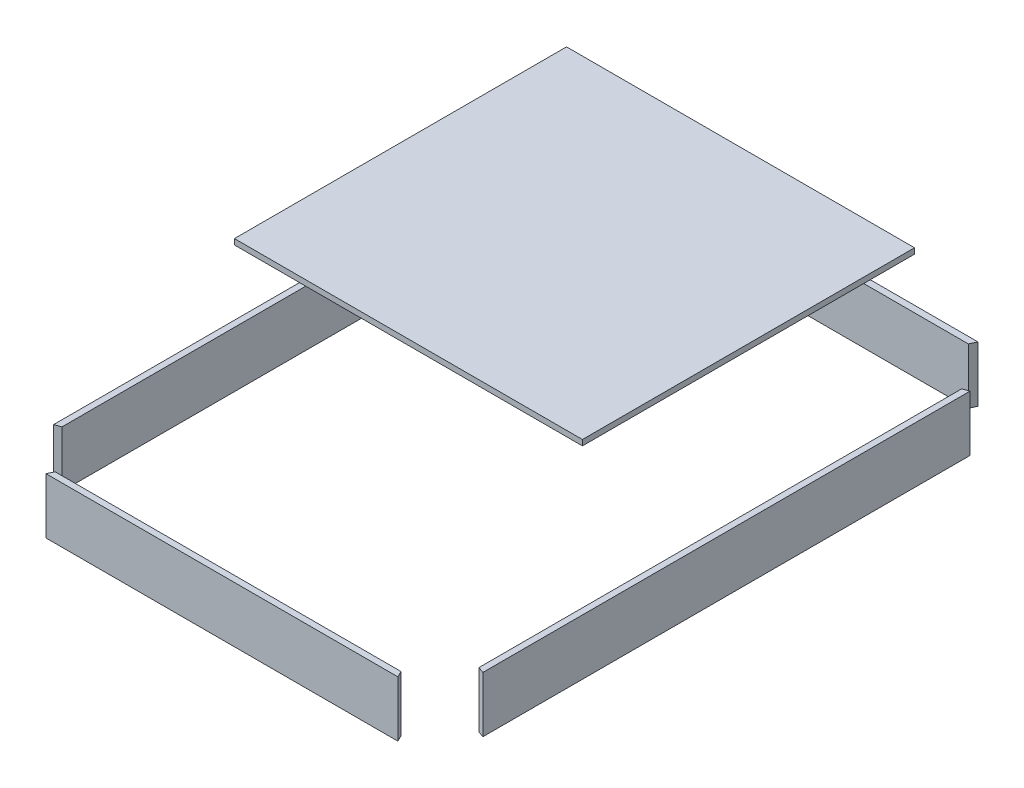
ISO-10303-21;
HEADER;
FILE_DESCRIPTION(('STEP AP214'),'2;1');
FILE_NAME('part.step','',(''),(''),'','','');
FILE_SCHEMA(('AUTOMOTIVE_DESIGN { 1 0 10303 214 1 1 1 1 }'));
ENDSEC;
DATA;
#1=APPLICATION_CONTEXT('core data for automotive mechanical design processes');
#2=APPLICATION_PROTOCOL_DEFINITION('international standard','automotive_design',2000,#1);
#3=PRODUCT_CONTEXT('',#1,'mechanical');
#4=PRODUCT('Part','Part','',(#3));
#5=PRODUCT_RELATED_PRODUCT_CATEGORY('part','',(#4));
#6=PRODUCT_DEFINITION_FORMATION('','',#4);
#7=PRODUCT_DEFINITION_CONTEXT('part definition',#1,'design');
#8=PRODUCT_DEFINITION('design','',#6,#7);
#9=PRODUCT_DEFINITION_SHAPE('','',#8);
#10=(LENGTH_UNIT() NAMED_UNIT(*) SI_UNIT(.MILLI.,.METRE.));
#11=(NAMED_UNIT(*) PLANE_ANGLE_UNIT() SI_UNIT($,.RADIAN.));
#12=(NAMED_UNIT(*) SI_UNIT($,.STERADIAN.) SOLID_ANGLE_UNIT());
#13=UNCERTAINTY_MEASURE_WITH_UNIT(LENGTH_MEASURE(1.E-05),#10,'distance_accuracy_value','');
#14=(GEOMETRIC_REPRESENTATION_CONTEXT(3) GLOBAL_UNCERTAINTY_ASSIGNED_CONTEXT((#13)) GLOBAL_UNIT_ASSIGNED_CONTEXT((#10,
#11,#12)) REPRESENTATION_CONTEXT('',''));
#15=CARTESIAN_POINT('',(0.,0.,0.));
#16=DIRECTION('',(0.,0.,1.));
#17=DIRECTION('',(1.,0.,0.));
#18=AXIS2_PLACEMENT_3D('',#15,#16,#17);
#19=CARTESIAN_POINT('',(-78.7960407572625,-25.4,-129.268825830541));
#20=DIRECTION('',(0.,0.,-1.));
#21=DIRECTION('',(-1.,0.,0.));
#22=AXIS2_PLACEMENT_3D('',#19,#20,#21);
#23=PLANE('',#22);
#24=DIRECTION('',(-1.,0.,0.));
#25=VECTOR('',#24,1.);
#26=CARTESIAN_POINT('',(-78.7960407572625,0.,-129.268825830541));
#27=LINE('',#26,#25);
#28=CARTESIAN_POINT('',(78.7960407572626,0.,-129.268825830541));
#29=VERTEX_POINT('',#28);
#30=CARTESIAN_POINT('',(-78.7960407572625,0.,-129.268825830541));
#31=VERTEX_POINT('',#30);
#32=EDGE_CURVE('E107',#29,#31,#27,.T.);
#33=ORIENTED_EDGE('',*,*,#32,.T.);
#34=DIRECTION('',(0.,1.,0.));
#35=VECTOR('',#34,1.);
#36=CARTESIAN_POINT('',(-78.7960407572625,-25.4,-129.268825830541));
#37=LINE('',#36,#35);
#38=CARTESIAN_POINT('',(-78.7960407572625,-25.4,-129.268825830541));
#39=VERTEX_POINT('',#38);
#40=EDGE_CURVE('E12',#39,#31,#37,.T.);
#41=ORIENTED_EDGE('',*,*,#40,.F.);
#42=DIRECTION('',(-1.,0.,0.));
#43=VECTOR('',#42,1.);
#44=CARTESIAN_POINT('',(-78.7960407572625,-25.4,-129.268825830541));
#45=LINE('',#44,#43);
#46=CARTESIAN_POINT('',(78.7960407572626,-25.4,-129.268825830541));
#47=VERTEX_POINT('',#46);
#48=EDGE_CURVE('E95',#47,#39,#45,.T.);
#49=ORIENTED_EDGE('',*,*,#48,.F.);
#50=DIRECTION('',(0.,1.,0.));
#51=VECTOR('',#50,1.);
#52=CARTESIAN_POINT('',(78.7960407572626,-25.4,-129.268825830541));
#53=LINE('',#52,#51);
#54=EDGE_CURVE('E103',#47,#29,#53,.T.);
#55=ORIENTED_EDGE('',*,*,#54,.T.);
#56=EDGE_LOOP('',(#33,#41,#49,#55));
#57=FACE_BOUND('',#56,.T.);
#58=ADVANCED_FACE('F44',(#57),#23,.F.);
#59=CARTESIAN_POINT('',(-80.2006783962915,-25.4,-132.258104784291));
#60=DIRECTION('',(0.905061400017154,0.,-0.425280921508347));
#61=DIRECTION('',(-0.425280921508347,0.,-0.905061400017154));
#62=AXIS2_PLACEMENT_3D('',#59,#60,#61);
#63=PLANE('',#62);
#64=DIRECTION('',(-0.425280921508347,0.,-0.905061400017154));
#65=VECTOR('',#64,1.);
#66=CARTESIAN_POINT('',(-80.2006783962915,0.,-132.258104784291));
#67=LINE('',#66,#65);
#68=CARTESIAN_POINT('',(-80.2006783962915,0.,-132.258104784291));
#69=VERTEX_POINT('',#68);
#70=EDGE_CURVE('E99',#31,#69,#67,.T.);
#71=ORIENTED_EDGE('',*,*,#70,.T.);
#72=DIRECTION('',(0.,1.,0.));
#73=VECTOR('',#72,1.);
#74=CARTESIAN_POINT('',(-80.2006783962915,-25.4,-132.258104784291));
#75=LINE('',#74,#73);
#76=CARTESIAN_POINT('',(-80.2006783962915,-25.4,-132.258104784291));
#77=VERTEX_POINT('',#76);
#78=EDGE_CURVE('E52',#77,#69,#75,.T.);
#79=ORIENTED_EDGE('',*,*,#78,.F.);
#80=DIRECTION('',(-0.425280921508347,0.,-0.905061400017154));
#81=VECTOR('',#80,1.);
#82=CARTESIAN_POINT('',(-80.2006783962915,-25.4,-132.258104784291));
#83=LINE('',#82,#81);
#84=EDGE_CURVE('E90',#39,#77,#83,.T.);
#85=ORIENTED_EDGE('',*,*,#84,.F.);
#86=ORIENTED_EDGE('',*,*,#40,.T.);
#87=EDGE_LOOP('',(#71,#79,#85,#86));
#88=FACE_BOUND('',#87,.T.);
#89=ADVANCED_FACE('F98',(#88),#63,.F.);
#90=CARTESIAN_POINT('',(80.2006783962915,-25.4,-132.258104784291));
#91=DIRECTION('',(0.,0.,1.));
#92=DIRECTION('',(1.,0.,0.));
#93=AXIS2_PLACEMENT_3D('',#90,#91,#92);
#94=PLANE('',#93);
#95=DIRECTION('',(1.,0.,0.));
#96=VECTOR('',#95,1.);
#97=CARTESIAN_POINT('',(80.2006783962915,0.,-132.258104784291));
#98=LINE('',#97,#96);
#99=CARTESIAN_POINT('',(80.2006783962915,0.,-132.258104784291));
#100=VERTEX_POINT('',#99);
#101=EDGE_CURVE('E77',#69,#100,#98,.T.);
#102=ORIENTED_EDGE('',*,*,#101,.T.);
#103=DIRECTION('',(0.,1.,0.));
#104=VECTOR('',#103,1.);
#105=CARTESIAN_POINT('',(80.2006783962915,-25.4,-132.258104784291));
#106=LINE('',#105,#104);
#107=CARTESIAN_POINT('',(80.2006783962915,-25.4,-132.258104784291));
#108=VERTEX_POINT('',#107);
#109=EDGE_CURVE('E100',#108,#100,#106,.T.);
#110=ORIENTED_EDGE('',*,*,#109,.F.);
#111=DIRECTION('',(1.,0.,0.));
#112=VECTOR('',#111,1.);
#113=CARTESIAN_POINT('',(80.2006783962915,-25.4,-132.258104784291));
#114=LINE('',#113,#112);
#115=EDGE_CURVE('E93',#77,#108,#114,.T.);
#116=ORIENTED_EDGE('',*,*,#115,.F.);
#117=ORIENTED_EDGE('',*,*,#78,.T.);
#118=EDGE_LOOP('',(#102,#110,#116,#117));
#119=FACE_BOUND('',#118,.T.);
#120=ADVANCED_FACE('F101',(#119),#94,.F.);
#121=CARTESIAN_POINT('',(78.7960407572626,-25.4,-129.268825830541));
#122=DIRECTION('',(-0.905061400017154,0.,-0.425280921508348));
#123=DIRECTION('',(-0.425280921508348,0.,0.905061400017154));
#124=AXIS2_PLACEMENT_3D('',#121,#122,#123);
#125=PLANE('',#124);
#126=DIRECTION('',(-0.425280921508348,0.,0.905061400017154));
#127=VECTOR('',#126,1.);
#128=CARTESIAN_POINT('',(78.7960407572626,0.,-129.268825830541));
#129=LINE('',#128,#127);
#130=EDGE_CURVE('E83',#100,#29,#129,.T.);
#131=ORIENTED_EDGE('',*,*,#130,.T.);
#132=ORIENTED_EDGE('',*,*,#54,.F.);
#133=DIRECTION('',(-0.425280921508348,0.,0.905061400017154));
#134=VECTOR('',#133,1.);
#135=CARTESIAN_POINT('',(78.7960407572626,-25.4,-129.268825830541));
#136=LINE('',#135,#134);
#137=EDGE_CURVE('E60',#108,#47,#136,.T.);
#138=ORIENTED_EDGE('',*,*,#137,.F.);
#139=ORIENTED_EDGE('',*,*,#109,.T.);
#140=EDGE_LOOP('',(#131,#132,#138,#139));
#141=FACE_BOUND('',#140,.T.);
#142=ADVANCED_FACE('F114',(#141),#125,.F.);
#143=CARTESIAN_POINT('',(0.,-25.4,0.));
#144=DIRECTION('',(0.,1.,0.));
#145=DIRECTION('',(0.,0.,1.));
#146=AXIS2_PLACEMENT_3D('',#143,#144,#145);
#147=PLANE('',#146);
#148=ORIENTED_EDGE('',*,*,#48,.T.);
#149=ORIENTED_EDGE('',*,*,#84,.T.);
#150=ORIENTED_EDGE('',*,*,#115,.T.);
#151=ORIENTED_EDGE('',*,*,#137,.T.);
#152=EDGE_LOOP('',(#148,#149,#150,#151));
#153=FACE_BOUND('',#152,.T.);
#154=ADVANCED_FACE('F91',(#153),#147,.F.);
#155=CARTESIAN_POINT('',(0.,0.,0.));
#156=DIRECTION('',(0.,1.,0.));
#157=DIRECTION('',(0.,0.,1.));
#158=AXIS2_PLACEMENT_3D('',#155,#156,#157);
#159=PLANE('',#158);
#160=ORIENTED_EDGE('',*,*,#32,.F.);
#161=ORIENTED_EDGE('',*,*,#130,.F.);
#162=ORIENTED_EDGE('',*,*,#101,.F.);
#163=ORIENTED_EDGE('',*,*,#70,.F.);
#164=EDGE_LOOP('',(#160,#161,#162,#163));
#165=FACE_BOUND('',#164,.T.);
#166=ADVANCED_FACE('F117',(#165),#159,.T.);
#167=CLOSED_SHELL('',(#58,#89,#120,#142,#154,#166));
#168=MANIFOLD_SOLID_BREP('B2',#167);
#169=CARTESIAN_POINT('',(94.9946235742718,-25.4,-109.985875571603));
#170=DIRECTION('',(0.99999999998955,0.,4.57161939259186E-06));
#171=DIRECTION('',(4.57161939259186E-06,0.,-0.99999999998955));
#172=AXIS2_PLACEMENT_3D('',#169,#170,#171);
#173=PLANE('',#172);
#174=DIRECTION('',(4.57161939259186E-06,0.,-0.99999999998955));
#175=VECTOR('',#174,1.);
#176=CARTESIAN_POINT('',(94.9946235742718,0.,-109.985875571603));
#177=LINE('',#176,#175);
#178=CARTESIAN_POINT('',(94.9936179310858,0.,109.989389131273));
#179=VERTEX_POINT('',#178);
#180=CARTESIAN_POINT('',(94.9946235742718,0.,-109.985875571603));
#181=VERTEX_POINT('',#180);
#182=EDGE_CURVE('E241',#179,#181,#177,.T.);
#183=ORIENTED_EDGE('',*,*,#182,.T.);
#184=DIRECTION('',(0.,1.,0.));
#185=VECTOR('',#184,1.);
#186=CARTESIAN_POINT('',(94.9946235742718,-25.4,-109.985875571603));
#187=LINE('',#186,#185);
#188=CARTESIAN_POINT('',(94.9946235742718,-25.4,-109.985875571603));
#189=VERTEX_POINT('',#188);
#190=EDGE_CURVE('E42',#189,#181,#187,.T.);
#191=ORIENTED_EDGE('',*,*,#190,.F.);
#192=DIRECTION('',(4.57161939259186E-06,0.,-0.99999999998955));
#193=VECTOR('',#192,1.);
#194=CARTESIAN_POINT('',(94.9946235742718,-25.4,-109.985875571603));
#195=LINE('',#194,#193);
#196=CARTESIAN_POINT('',(94.9936179310858,-25.4,109.989389131273));
#197=VERTEX_POINT('',#196);
#198=EDGE_CURVE('E229',#197,#189,#195,.T.);
#199=ORIENTED_EDGE('',*,*,#198,.F.);
#200=DIRECTION('',(0.,1.,0.));
#201=VECTOR('',#200,1.);
#202=CARTESIAN_POINT('',(94.9936179310858,-25.4,109.989389131273));
#203=LINE('',#202,#201);
#204=EDGE_CURVE('E237',#197,#179,#203,.T.);
#205=ORIENTED_EDGE('',*,*,#204,.T.);
#206=EDGE_LOOP('',(#183,#191,#199,#205));
#207=FACE_BOUND('',#206,.T.);
#208=ADVANCED_FACE('F178',(#207),#173,.F.);
#209=CARTESIAN_POINT('',(97.8074245730822,-25.4,-111.038281650387));
#210=DIRECTION('',(0.35042439410458,0.,0.936591022814354));
#211=DIRECTION('',(0.936591022814354,0.,-0.35042439410458));
#212=AXIS2_PLACEMENT_3D('',#209,#210,#211);
#213=PLANE('',#212);
#214=DIRECTION('',(0.936591022814354,0.,-0.35042439410458));
#215=VECTOR('',#214,1.);
#216=CARTESIAN_POINT('',(97.8074245730822,0.,-111.038281650387));
#217=LINE('',#216,#215);
#218=CARTESIAN_POINT('',(97.8074245730822,0.,-111.038281650387));
#219=VERTEX_POINT('',#218);
#220=EDGE_CURVE('E233',#181,#219,#217,.T.);
#221=ORIENTED_EDGE('',*,*,#220,.T.);
#222=DIRECTION('',(0.,1.,0.));
#223=VECTOR('',#222,1.);
#224=CARTESIAN_POINT('',(97.8074245730822,-25.4,-111.038281650387));
#225=LINE('',#224,#223);
#226=CARTESIAN_POINT('',(97.8074245730822,-25.4,-111.038281650387));
#227=VERTEX_POINT('',#226);
#228=EDGE_CURVE('E186',#227,#219,#225,.T.);
#229=ORIENTED_EDGE('',*,*,#228,.F.);
#230=DIRECTION('',(0.936591022814354,0.,-0.35042439410458));
#231=VECTOR('',#230,1.);
#232=CARTESIAN_POINT('',(97.8074245730822,-25.4,-111.038281650387));
#233=LINE('',#232,#231);
#234=EDGE_CURVE('E224',#189,#227,#233,.T.);
#235=ORIENTED_EDGE('',*,*,#234,.F.);
#236=ORIENTED_EDGE('',*,*,#190,.T.);
#237=EDGE_LOOP('',(#221,#229,#235,#236));
#238=FACE_BOUND('',#237,.T.);
#239=ADVANCED_FACE('F232',(#238),#213,.F.);
#240=CARTESIAN_POINT('',(97.8139744570367,-25.4,111.011381018634));
#241=DIRECTION('',(-0.999999999564952,0.,2.94973830311224E-05));
#242=DIRECTION('',(2.94973830311224E-05,0.,0.999999999564952));
#243=AXIS2_PLACEMENT_3D('',#240,#241,#242);
#244=PLANE('',#243);
#245=DIRECTION('',(2.94973830311224E-05,0.,0.999999999564952));
#246=VECTOR('',#245,1.);
#247=CARTESIAN_POINT('',(97.8139744570367,0.,111.011381018634));
#248=LINE('',#247,#246);
#249=CARTESIAN_POINT('',(97.8139744570367,0.,111.011381018634));
#250=VERTEX_POINT('',#249);
#251=EDGE_CURVE('E211',#219,#250,#248,.T.);
#252=ORIENTED_EDGE('',*,*,#251,.T.);
#253=DIRECTION('',(0.,1.,0.));
#254=VECTOR('',#253,1.);
#255=CARTESIAN_POINT('',(97.8139744570367,-25.4,111.011381018634));
#256=LINE('',#255,#254);
#257=CARTESIAN_POINT('',(97.8139744570367,-25.4,111.011381018634));
#258=VERTEX_POINT('',#257);
#259=EDGE_CURVE('E234',#258,#250,#256,.T.);
#260=ORIENTED_EDGE('',*,*,#259,.F.);
#261=DIRECTION('',(2.94973830311224E-05,0.,0.999999999564952));
#262=VECTOR('',#261,1.);
#263=CARTESIAN_POINT('',(97.8139744570367,-25.4,111.011381018634));
#264=LINE('',#263,#262);
#265=EDGE_CURVE('E227',#227,#258,#264,.T.);
#266=ORIENTED_EDGE('',*,*,#265,.F.);
#267=ORIENTED_EDGE('',*,*,#228,.T.);
#268=EDGE_LOOP('',(#252,#260,#266,#267));
#269=FACE_BOUND('',#268,.T.);
#270=ADVANCED_FACE('F235',(#269),#244,.F.);
#271=CARTESIAN_POINT('',(94.9936179310858,-25.4,109.989389131273));
#272=DIRECTION('',(0.340685192509614,0.,-0.940177429852837));
#273=DIRECTION('',(-0.940177429852837,0.,-0.340685192509614));
#274=AXIS2_PLACEMENT_3D('',#271,#272,#273);
#275=PLANE('',#274);
#276=DIRECTION('',(-0.940177429852837,0.,-0.340685192509614));
#277=VECTOR('',#276,1.);
#278=CARTESIAN_POINT('',(94.9936179310858,0.,109.989389131273));
#279=LINE('',#278,#277);
#280=EDGE_CURVE('E217',#250,#179,#279,.T.);
#281=ORIENTED_EDGE('',*,*,#280,.T.);
#282=ORIENTED_EDGE('',*,*,#204,.F.);
#283=DIRECTION('',(-0.940177429852837,0.,-0.340685192509614));
#284=VECTOR('',#283,1.);
#285=CARTESIAN_POINT('',(94.9936179310858,-25.4,109.989389131273));
#286=LINE('',#285,#284);
#287=EDGE_CURVE('E194',#258,#197,#286,.T.);
#288=ORIENTED_EDGE('',*,*,#287,.F.);
#289=ORIENTED_EDGE('',*,*,#259,.T.);
#290=EDGE_LOOP('',(#281,#282,#288,#289));
#291=FACE_BOUND('',#290,.T.);
#292=ADVANCED_FACE('F248',(#291),#275,.F.);
#293=CARTESIAN_POINT('',(0.,-25.4,0.));
#294=DIRECTION('',(0.,1.,0.));
#295=DIRECTION('',(0.,0.,1.));
#296=AXIS2_PLACEMENT_3D('',#293,#294,#295);
#297=PLANE('',#296);
#298=ORIENTED_EDGE('',*,*,#198,.T.);
#299=ORIENTED_EDGE('',*,*,#234,.T.);
#300=ORIENTED_EDGE('',*,*,#265,.T.);
#301=ORIENTED_EDGE('',*,*,#287,.T.);
#302=EDGE_LOOP('',(#298,#299,#300,#301));
#303=FACE_BOUND('',#302,.T.);
#304=ADVANCED_FACE('F225',(#303),#297,.F.);
#305=CARTESIAN_POINT('',(0.,0.,0.));
#306=DIRECTION('',(0.,1.,0.));
#307=DIRECTION('',(0.,0.,1.));
#308=AXIS2_PLACEMENT_3D('',#305,#306,#307);
#309=PLANE('',#308);
#310=ORIENTED_EDGE('',*,*,#182,.F.);
#311=ORIENTED_EDGE('',*,*,#280,.F.);
#312=ORIENTED_EDGE('',*,*,#251,.F.);
#313=ORIENTED_EDGE('',*,*,#220,.F.);
#314=EDGE_LOOP('',(#310,#311,#312,#313));
#315=FACE_BOUND('',#314,.T.);
#316=ADVANCED_FACE('F251',(#315),#309,.T.);
#317=CLOSED_SHELL('',(#208,#239,#270,#292,#304,#316));
#318=MANIFOLD_SOLID_BREP('B6',#317);
#319=CARTESIAN_POINT('',(-80.1660532850071,-25.4,132.104464391493));
#320=DIRECTION('',(0.899897378452737,0.,0.436101717783696));
#321=DIRECTION('',(0.436101717783696,0.,-0.899897378452738));
#322=AXIS2_PLACEMENT_3D('',#319,#320,#321);
#323=PLANE('',#322);
#324=DIRECTION('',(0.436101717783696,0.,-0.899897378452738));
#325=VECTOR('',#324,1.);
#326=CARTESIAN_POINT('',(-80.1660532850071,0.,132.104464391493));
#327=LINE('',#326,#325);
#328=CARTESIAN_POINT('',(-80.1660532850071,0.,132.104464391493));
#329=VERTEX_POINT('',#328);
#330=CARTESIAN_POINT('',(-78.7990771583731,0.,129.283704503142));
#331=VERTEX_POINT('',#330);
#332=EDGE_CURVE('E375',#329,#331,#327,.T.);
#333=ORIENTED_EDGE('',*,*,#332,.T.);
#334=DIRECTION('',(0.,1.,0.));
#335=VECTOR('',#334,1.);
#336=CARTESIAN_POINT('',(-78.7990771583731,-25.4,129.283704503142));
#337=LINE('',#336,#335);
#338=CARTESIAN_POINT('',(-78.7990771583731,-25.4,129.283704503142));
#339=VERTEX_POINT('',#338);
#340=EDGE_CURVE('E176',#339,#331,#337,.T.);
#341=ORIENTED_EDGE('',*,*,#340,.F.);
#342=DIRECTION('',(0.436101717783696,0.,-0.899897378452738));
#343=VECTOR('',#342,1.);
#344=CARTESIAN_POINT('',(-80.1660532850071,-25.4,132.104464391493));
#345=LINE('',#344,#343);
#346=CARTESIAN_POINT('',(-80.1660532850071,-25.4,132.104464391493));
#347=VERTEX_POINT('',#346);
#348=EDGE_CURVE('E363',#347,#339,#345,.T.);
#349=ORIENTED_EDGE('',*,*,#348,.F.);
#350=DIRECTION('',(0.,1.,0.));
#351=VECTOR('',#350,1.);
#352=CARTESIAN_POINT('',(-80.1660532850071,-25.4,132.104464391493));
#353=LINE('',#352,#351);
#354=EDGE_CURVE('E371',#347,#329,#353,.T.);
#355=ORIENTED_EDGE('',*,*,#354,.T.);
#356=EDGE_LOOP('',(#333,#341,#349,#355));
#357=FACE_BOUND('',#356,.T.);
#358=ADVANCED_FACE('F312',(#357),#323,.F.);
#359=CARTESIAN_POINT('',(-78.7990771583731,-25.4,129.283704503142));
#360=DIRECTION('',(0.,0.,1.));
#361=DIRECTION('',(1.,0.,0.));
#362=AXIS2_PLACEMENT_3D('',#359,#360,#361);
#363=PLANE('',#362);
#364=DIRECTION('',(1.,0.,0.));
#365=VECTOR('',#364,1.);
#366=CARTESIAN_POINT('',(-78.7990771583731,0.,129.283704503142));
#367=LINE('',#366,#365);
#368=CARTESIAN_POINT('',(78.7990771583732,0.,129.283704503142));
#369=VERTEX_POINT('',#368);
#370=EDGE_CURVE('E367',#331,#369,#367,.T.);
#371=ORIENTED_EDGE('',*,*,#370,.T.);
#372=DIRECTION('',(0.,1.,0.));
#373=VECTOR('',#372,1.);
#374=CARTESIAN_POINT('',(78.7990771583732,-25.4,129.283704503142));
#375=LINE('',#374,#373);
#376=CARTESIAN_POINT('',(78.7990771583732,-25.4,129.283704503142));
#377=VERTEX_POINT('',#376);
#378=EDGE_CURVE('E320',#377,#369,#375,.T.);
#379=ORIENTED_EDGE('',*,*,#378,.F.);
#380=DIRECTION('',(1.,0.,0.));
#381=VECTOR('',#380,1.);
#382=CARTESIAN_POINT('',(-78.7990771583731,-25.4,129.283704503142));
#383=LINE('',#382,#381);
#384=EDGE_CURVE('E358',#339,#377,#383,.T.);
#385=ORIENTED_EDGE('',*,*,#384,.F.);
#386=ORIENTED_EDGE('',*,*,#340,.T.);
#387=EDGE_LOOP('',(#371,#379,#385,#386));
#388=FACE_BOUND('',#387,.T.);
#389=ADVANCED_FACE('F366',(#388),#363,.F.);
#390=CARTESIAN_POINT('',(78.7990771583732,-25.4,129.283704503142));
#391=DIRECTION('',(-0.899897378452738,0.,0.436101717783696));
#392=DIRECTION('',(0.436101717783696,0.,0.899897378452738));
#393=AXIS2_PLACEMENT_3D('',#390,#391,#392);
#394=PLANE('',#393);
#395=DIRECTION('',(0.436101717783696,0.,0.899897378452738));
#396=VECTOR('',#395,1.);
#397=CARTESIAN_POINT('',(78.7990771583732,0.,129.283704503142));
#398=LINE('',#397,#396);
#399=CARTESIAN_POINT('',(80.1660532850072,0.,132.104464391493));
#400=VERTEX_POINT('',#399);
#401=EDGE_CURVE('E345',#369,#400,#398,.T.);
#402=ORIENTED_EDGE('',*,*,#401,.T.);
#403=DIRECTION('',(0.,1.,0.));
#404=VECTOR('',#403,1.);
#405=CARTESIAN_POINT('',(80.1660532850072,-25.4,132.104464391493));
#406=LINE('',#405,#404);
#407=CARTESIAN_POINT('',(80.1660532850072,-25.4,132.104464391493));
#408=VERTEX_POINT('',#407);
#409=EDGE_CURVE('E368',#408,#400,#406,.T.);
#410=ORIENTED_EDGE('',*,*,#409,.F.);
#411=DIRECTION('',(0.436101717783696,0.,0.899897378452738));
#412=VECTOR('',#411,1.);
#413=CARTESIAN_POINT('',(78.7990771583732,-25.4,129.283704503142));
#414=LINE('',#413,#412);
#415=EDGE_CURVE('E361',#377,#408,#414,.T.);
#416=ORIENTED_EDGE('',*,*,#415,.F.);
#417=ORIENTED_EDGE('',*,*,#378,.T.);
#418=EDGE_LOOP('',(#402,#410,#416,#417));
#419=FACE_BOUND('',#418,.T.);
#420=ADVANCED_FACE('F369',(#419),#394,.F.);
#421=CARTESIAN_POINT('',(80.1660532850072,-25.4,132.104464391493));
#422=DIRECTION('',(0.,0.,-1.));
#423=DIRECTION('',(-1.,0.,0.));
#424=AXIS2_PLACEMENT_3D('',#421,#422,#423);
#425=PLANE('',#424);
#426=DIRECTION('',(-1.,0.,0.));
#427=VECTOR('',#426,1.);
#428=CARTESIAN_POINT('',(80.1660532850072,0.,132.104464391493));
#429=LINE('',#428,#427);
#430=EDGE_CURVE('E351',#400,#329,#429,.T.);
#431=ORIENTED_EDGE('',*,*,#430,.T.);
#432=ORIENTED_EDGE('',*,*,#354,.F.);
#433=DIRECTION('',(-1.,0.,0.));
#434=VECTOR('',#433,1.);
#435=CARTESIAN_POINT('',(80.1660532850072,-25.4,132.104464391493));
#436=LINE('',#435,#434);
#437=EDGE_CURVE('E328',#408,#347,#436,.T.);
#438=ORIENTED_EDGE('',*,*,#437,.F.);
#439=ORIENTED_EDGE('',*,*,#409,.T.);
#440=EDGE_LOOP('',(#431,#432,#438,#439));
#441=FACE_BOUND('',#440,.T.);
#442=ADVANCED_FACE('F382',(#441),#425,.F.);
#443=CARTESIAN_POINT('',(0.,-25.4,0.));
#444=DIRECTION('',(0.,-1.,0.));
#445=DIRECTION('',(0.,0.,-1.));
#446=AXIS2_PLACEMENT_3D('',#443,#444,#445);
#447=PLANE('',#446);
#448=ORIENTED_EDGE('',*,*,#348,.T.);
#449=ORIENTED_EDGE('',*,*,#384,.T.);
#450=ORIENTED_EDGE('',*,*,#415,.T.);
#451=ORIENTED_EDGE('',*,*,#437,.T.);
#452=EDGE_LOOP('',(#448,#449,#450,#451));
#453=FACE_BOUND('',#452,.T.);
#454=ADVANCED_FACE('F359',(#453),#447,.T.);
#455=CARTESIAN_POINT('',(0.,0.,0.));
#456=DIRECTION('',(0.,-1.,0.));
#457=DIRECTION('',(0.,0.,-1.));
#458=AXIS2_PLACEMENT_3D('',#455,#456,#457);
#459=PLANE('',#458);
#460=ORIENTED_EDGE('',*,*,#332,.F.);
#461=ORIENTED_EDGE('',*,*,#430,.F.);
#462=ORIENTED_EDGE('',*,*,#401,.F.);
#463=ORIENTED_EDGE('',*,*,#370,.F.);
#464=EDGE_LOOP('',(#460,#461,#462,#463));
#465=FACE_BOUND('',#464,.T.);
#466=ADVANCED_FACE('F385',(#465),#459,.F.);
#467=CLOSED_SHELL('',(#358,#389,#420,#442,#454,#466));
#468=MANIFOLD_SOLID_BREP('B36',#467);
#469=CARTESIAN_POINT('',(-97.8139744570367,-25.4,111.011381018634));
#470=DIRECTION('',(0.999999999564952,0.,2.94973830309974E-05));
#471=DIRECTION('',(2.94973830309974E-05,0.,-0.999999999564952));
#472=AXIS2_PLACEMENT_3D('',#469,#470,#471);
#473=PLANE('',#472);
#474=DIRECTION('',(2.94973830309974E-05,0.,-0.999999999564952));
#475=VECTOR('',#474,1.);
#476=CARTESIAN_POINT('',(-97.8139744570367,0.,111.011381018634));
#477=LINE('',#476,#475);
#478=CARTESIAN_POINT('',(-97.8139744570367,0.,111.011381018634));
#479=VERTEX_POINT('',#478);
#480=CARTESIAN_POINT('',(-97.8074245730822,0.,-111.038281650387));
#481=VERTEX_POINT('',#480);
#482=EDGE_CURVE('E508',#479,#481,#477,.T.);
#483=ORIENTED_EDGE('',*,*,#482,.T.);
#484=DIRECTION('',(0.,1.,0.));
#485=VECTOR('',#484,1.);
#486=CARTESIAN_POINT('',(-97.8074245730822,-25.4,-111.038281650387));
#487=LINE('',#486,#485);
#488=CARTESIAN_POINT('',(-97.8074245730822,-25.4,-111.038281650387));
#489=VERTEX_POINT('',#488);
#490=EDGE_CURVE('E310',#489,#481,#487,.T.);
#491=ORIENTED_EDGE('',*,*,#490,.F.);
#492=DIRECTION('',(2.94973830309974E-05,0.,-0.999999999564952));
#493=VECTOR('',#492,1.);
#494=CARTESIAN_POINT('',(-97.8139744570367,-25.4,111.011381018634));
#495=LINE('',#494,#493);
#496=CARTESIAN_POINT('',(-97.8139744570367,-25.4,111.011381018634));
#497=VERTEX_POINT('',#496);
#498=EDGE_CURVE('E496',#497,#489,#495,.T.);
#499=ORIENTED_EDGE('',*,*,#498,.F.);
#500=DIRECTION('',(0.,1.,0.));
#501=VECTOR('',#500,1.);
#502=CARTESIAN_POINT('',(-97.8139744570367,-25.4,111.011381018634));
#503=LINE('',#502,#501);
#504=EDGE_CURVE('E504',#497,#479,#503,.T.);
#505=ORIENTED_EDGE('',*,*,#504,.T.);
#506=EDGE_LOOP('',(#483,#491,#499,#505));
#507=FACE_BOUND('',#506,.T.);
#508=ADVANCED_FACE('F445',(#507),#473,.F.);
#509=CARTESIAN_POINT('',(-97.8074245730822,-25.4,-111.038281650387));
#510=DIRECTION('',(-0.350424394104614,0.,0.936591022814341));
#511=DIRECTION('',(0.936591022814342,0.,0.350424394104614));
#512=AXIS2_PLACEMENT_3D('',#509,#510,#511);
#513=PLANE('',#512);
#514=DIRECTION('',(0.936591022814342,0.,0.350424394104614));
#515=VECTOR('',#514,1.);
#516=CARTESIAN_POINT('',(-97.8074245730822,0.,-111.038281650387));
#517=LINE('',#516,#515);
#518=CARTESIAN_POINT('',(-94.9946235742718,0.,-109.985875571603));
#519=VERTEX_POINT('',#518);
#520=EDGE_CURVE('E500',#481,#519,#517,.T.);
#521=ORIENTED_EDGE('',*,*,#520,.T.);
#522=DIRECTION('',(0.,1.,0.));
#523=VECTOR('',#522,1.);
#524=CARTESIAN_POINT('',(-94.9946235742718,-25.4,-109.985875571603));
#525=LINE('',#524,#523);
#526=CARTESIAN_POINT('',(-94.9946235742718,-25.4,-109.985875571603));
#527=VERTEX_POINT('',#526);
#528=EDGE_CURVE('E453',#527,#519,#525,.T.);
#529=ORIENTED_EDGE('',*,*,#528,.F.);
#530=DIRECTION('',(0.936591022814342,0.,0.350424394104614));
#531=VECTOR('',#530,1.);
#532=CARTESIAN_POINT('',(-97.8074245730822,-25.4,-111.038281650387));
#533=LINE('',#532,#531);
#534=EDGE_CURVE('E491',#489,#527,#533,.T.);
#535=ORIENTED_EDGE('',*,*,#534,.F.);
#536=ORIENTED_EDGE('',*,*,#490,.T.);
#537=EDGE_LOOP('',(#521,#529,#535,#536));
#538=FACE_BOUND('',#537,.T.);
#539=ADVANCED_FACE('F499',(#538),#513,.F.);
#540=CARTESIAN_POINT('',(-94.9946235742718,-25.4,-109.985875571603));
#541=DIRECTION('',(-0.99999999998955,0.,4.57161939303347E-06));
#542=DIRECTION('',(4.57161939303347E-06,0.,0.99999999998955));
#543=AXIS2_PLACEMENT_3D('',#540,#541,#542);
#544=PLANE('',#543);
#545=DIRECTION('',(4.57161939303347E-06,0.,0.99999999998955));
#546=VECTOR('',#545,1.);
#547=CARTESIAN_POINT('',(-94.9946235742718,0.,-109.985875571603));
#548=LINE('',#547,#546);
#549=CARTESIAN_POINT('',(-94.9936179310857,0.,109.989389131273));
#550=VERTEX_POINT('',#549);
#551=EDGE_CURVE('E478',#519,#550,#548,.T.);
#552=ORIENTED_EDGE('',*,*,#551,.T.);
#553=DIRECTION('',(0.,1.,0.));
#554=VECTOR('',#553,1.);
#555=CARTESIAN_POINT('',(-94.9936179310857,-25.4,109.989389131273));
#556=LINE('',#555,#554);
#557=CARTESIAN_POINT('',(-94.9936179310857,-25.4,109.989389131273));
#558=VERTEX_POINT('',#557);
#559=EDGE_CURVE('E501',#558,#550,#556,.T.);
#560=ORIENTED_EDGE('',*,*,#559,.F.);
#561=DIRECTION('',(4.57161939303347E-06,0.,0.99999999998955));
#562=VECTOR('',#561,1.);
#563=CARTESIAN_POINT('',(-94.9946235742718,-25.4,-109.985875571603));
#564=LINE('',#563,#562);
#565=EDGE_CURVE('E494',#527,#558,#564,.T.);
#566=ORIENTED_EDGE('',*,*,#565,.F.);
#567=ORIENTED_EDGE('',*,*,#528,.T.);
#568=EDGE_LOOP('',(#552,#560,#566,#567));
#569=FACE_BOUND('',#568,.T.);
#570=ADVANCED_FACE('F502',(#569),#544,.F.);
#571=CARTESIAN_POINT('',(-94.9936179310857,-25.4,109.989389131273));
#572=DIRECTION('',(-0.340685192509608,0.,-0.940177429852839));
#573=DIRECTION('',(-0.94017742985284,0.,0.340685192509608));
#574=AXIS2_PLACEMENT_3D('',#571,#572,#573);
#575=PLANE('',#574);
#576=DIRECTION('',(-0.94017742985284,0.,0.340685192509608));
#577=VECTOR('',#576,1.);
#578=CARTESIAN_POINT('',(-94.9936179310857,0.,109.989389131273));
#579=LINE('',#578,#577);
#580=EDGE_CURVE('E484',#550,#479,#579,.T.);
#581=ORIENTED_EDGE('',*,*,#580,.T.);
#582=ORIENTED_EDGE('',*,*,#504,.F.);
#583=DIRECTION('',(-0.94017742985284,0.,0.340685192509608));
#584=VECTOR('',#583,1.);
#585=CARTESIAN_POINT('',(-94.9936179310857,-25.4,109.989389131273));
#586=LINE('',#585,#584);
#587=EDGE_CURVE('E461',#558,#497,#586,.T.);
#588=ORIENTED_EDGE('',*,*,#587,.F.);
#589=ORIENTED_EDGE('',*,*,#559,.T.);
#590=EDGE_LOOP('',(#581,#582,#588,#589));
#591=FACE_BOUND('',#590,.T.);
#592=ADVANCED_FACE('F515',(#591),#575,.F.);
#593=CARTESIAN_POINT('',(0.,-25.4,0.));
#594=DIRECTION('',(0.,1.,0.));
#595=DIRECTION('',(0.,0.,1.));
#596=AXIS2_PLACEMENT_3D('',#593,#594,#595);
#597=PLANE('',#596);
#598=ORIENTED_EDGE('',*,*,#498,.T.);
#599=ORIENTED_EDGE('',*,*,#534,.T.);
#600=ORIENTED_EDGE('',*,*,#565,.T.);
#601=ORIENTED_EDGE('',*,*,#587,.T.);
#602=EDGE_LOOP('',(#598,#599,#600,#601));
#603=FACE_BOUND('',#602,.T.);
#604=ADVANCED_FACE('F492',(#603),#597,.F.);
#605=CARTESIAN_POINT('',(0.,0.,0.));
#606=DIRECTION('',(0.,1.,0.));
#607=DIRECTION('',(0.,0.,1.));
#608=AXIS2_PLACEMENT_3D('',#605,#606,#607);
#609=PLANE('',#608);
#610=ORIENTED_EDGE('',*,*,#482,.F.);
#611=ORIENTED_EDGE('',*,*,#580,.F.);
#612=ORIENTED_EDGE('',*,*,#551,.F.);
#613=ORIENTED_EDGE('',*,*,#520,.F.);
#614=EDGE_LOOP('',(#610,#611,#612,#613));
#615=FACE_BOUND('',#614,.T.);
#616=ADVANCED_FACE('F518',(#615),#609,.T.);
#617=CLOSED_SHELL('',(#508,#539,#570,#592,#604,#616));
#618=MANIFOLD_SOLID_BREP('B170',#617);
#619=CARTESIAN_POINT('',(-79.2153060416913,50.8,47.1801864023253));
#620=DIRECTION('',(1.,0.,0.));
#621=DIRECTION('',(0.,0.,-1.));
#622=AXIS2_PLACEMENT_3D('',#619,#620,#621);
#623=PLANE('',#622);
#624=DIRECTION('',(0.,0.,1.));
#625=VECTOR('',#624,1.);
#626=CARTESIAN_POINT('',(-79.2153060416913,48.26,47.1801864023253));
#627=LINE('',#626,#625);
#628=CARTESIAN_POINT('',(-79.2153060416913,48.26,-104.155157699491));
#629=VERTEX_POINT('',#628);
#630=CARTESIAN_POINT('',(-79.2153060416913,48.26,47.1801864023253));
#631=VERTEX_POINT('',#630);
#632=EDGE_CURVE('E632',#629,#631,#627,.T.);
#633=ORIENTED_EDGE('',*,*,#632,.T.);
#634=DIRECTION('',(0.,-1.,0.));
#635=VECTOR('',#634,1.);
#636=CARTESIAN_POINT('',(-79.2153060416913,50.8,47.1801864023253));
#637=LINE('',#636,#635);
#638=CARTESIAN_POINT('',(-79.2153060416913,50.8,47.1801864023253));
#639=VERTEX_POINT('',#638);
#640=EDGE_CURVE('E443',#639,#631,#637,.T.);
#641=ORIENTED_EDGE('',*,*,#640,.F.);
#642=DIRECTION('',(0.,0.,1.));
#643=VECTOR('',#642,1.);
#644=CARTESIAN_POINT('',(-79.2153060416913,50.8,47.1801864023253));
#645=LINE('',#644,#643);
#646=CARTESIAN_POINT('',(-79.2153060416913,50.8,-104.155157699491));
#647=VERTEX_POINT('',#646);
#648=EDGE_CURVE('E620',#647,#639,#645,.T.);
#649=ORIENTED_EDGE('',*,*,#648,.F.);
#650=DIRECTION('',(0.,-1.,0.));
#651=VECTOR('',#650,1.);
#652=CARTESIAN_POINT('',(-79.2153060416913,50.8,-104.155157699491));
#653=LINE('',#652,#651);
#654=EDGE_CURVE('E628',#647,#629,#653,.T.);
#655=ORIENTED_EDGE('',*,*,#654,.T.);
#656=EDGE_LOOP('',(#633,#641,#649,#655));
#657=FACE_BOUND('',#656,.T.);
#658=ADVANCED_FACE('F569',(#657),#623,.F.);
#659=CARTESIAN_POINT('',(-79.2153060416913,50.8,47.1801864023253));
#660=DIRECTION('',(0.,0.,-1.));
#661=DIRECTION('',(-1.,0.,0.));
#662=AXIS2_PLACEMENT_3D('',#659,#660,#661);
#663=PLANE('',#662);
#664=DIRECTION('',(1.,0.,0.));
#665=VECTOR('',#664,1.);
#666=CARTESIAN_POINT('',(-79.2153060416913,48.26,47.1801864023253));
#667=LINE('',#666,#665);
#668=CARTESIAN_POINT('',(79.375,48.26,47.1801864023253));
#669=VERTEX_POINT('',#668);
#670=EDGE_CURVE('E624',#631,#669,#667,.T.);
#671=ORIENTED_EDGE('',*,*,#670,.T.);
#672=DIRECTION('',(0.,-1.,0.));
#673=VECTOR('',#672,1.);
#674=CARTESIAN_POINT('',(79.375,50.8,47.1801864023253));
#675=LINE('',#674,#673);
#676=CARTESIAN_POINT('',(79.375,50.8,47.1801864023253));
#677=VERTEX_POINT('',#676);
#678=EDGE_CURVE('E577',#677,#669,#675,.T.);
#679=ORIENTED_EDGE('',*,*,#678,.F.);
#680=DIRECTION('',(1.,0.,0.));
#681=VECTOR('',#680,1.);
#682=CARTESIAN_POINT('',(-79.2153060416913,50.8,47.1801864023253));
#683=LINE('',#682,#681);
#684=EDGE_CURVE('E615',#639,#677,#683,.T.);
#685=ORIENTED_EDGE('',*,*,#684,.F.);
#686=ORIENTED_EDGE('',*,*,#640,.T.);
#687=EDGE_LOOP('',(#671,#679,#685,#686));
#688=FACE_BOUND('',#687,.T.);
#689=ADVANCED_FACE('F623',(#688),#663,.F.);
#690=CARTESIAN_POINT('',(79.375,50.8,47.1801864023253));
#691=DIRECTION('',(-1.,0.,0.));
#692=DIRECTION('',(0.,0.,1.));
#693=AXIS2_PLACEMENT_3D('',#690,#691,#692);
#694=PLANE('',#693);
#695=DIRECTION('',(0.,0.,-1.));
#696=VECTOR('',#695,1.);
#697=CARTESIAN_POINT('',(79.375,48.26,47.1801864023253));
#698=LINE('',#697,#696);
#699=CARTESIAN_POINT('',(79.375,48.26,-104.155157699491));
#700=VERTEX_POINT('',#699);
#701=EDGE_CURVE('E602',#669,#700,#698,.T.);
#702=ORIENTED_EDGE('',*,*,#701,.T.);
#703=DIRECTION('',(0.,-1.,0.));
#704=VECTOR('',#703,1.);
#705=CARTESIAN_POINT('',(79.375,50.8,-104.155157699491));
#706=LINE('',#705,#704);
#707=CARTESIAN_POINT('',(79.375,50.8,-104.155157699491));
#708=VERTEX_POINT('',#707);
#709=EDGE_CURVE('E625',#708,#700,#706,.T.);
#710=ORIENTED_EDGE('',*,*,#709,.F.);
#711=DIRECTION('',(0.,0.,-1.));
#712=VECTOR('',#711,1.);
#713=CARTESIAN_POINT('',(79.375,50.8,47.1801864023253));
#714=LINE('',#713,#712);
#715=EDGE_CURVE('E618',#677,#708,#714,.T.);
#716=ORIENTED_EDGE('',*,*,#715,.F.);
#717=ORIENTED_EDGE('',*,*,#678,.T.);
#718=EDGE_LOOP('',(#702,#710,#716,#717));
#719=FACE_BOUND('',#718,.T.);
#720=ADVANCED_FACE('F626',(#719),#694,.F.);
#721=CARTESIAN_POINT('',(-79.2153060416913,50.8,-104.155157699491));
#722=DIRECTION('',(0.,0.,1.));
#723=DIRECTION('',(1.,0.,0.));
#724=AXIS2_PLACEMENT_3D('',#721,#722,#723);
#725=PLANE('',#724);
#726=DIRECTION('',(-1.,0.,0.));
#727=VECTOR('',#726,1.);
#728=CARTESIAN_POINT('',(-79.2153060416913,48.26,-104.155157699491));
#729=LINE('',#728,#727);
#730=EDGE_CURVE('E608',#700,#629,#729,.T.);
#731=ORIENTED_EDGE('',*,*,#730,.T.);
#732=ORIENTED_EDGE('',*,*,#654,.F.);
#733=DIRECTION('',(-1.,0.,0.));
#734=VECTOR('',#733,1.);
#735=CARTESIAN_POINT('',(-79.2153060416913,50.8,-104.155157699491));
#736=LINE('',#735,#734);
#737=EDGE_CURVE('E585',#708,#647,#736,.T.);
#738=ORIENTED_EDGE('',*,*,#737,.F.);
#739=ORIENTED_EDGE('',*,*,#709,.T.);
#740=EDGE_LOOP('',(#731,#732,#738,#739));
#741=FACE_BOUND('',#740,.T.);
#742=ADVANCED_FACE('F639',(#741),#725,.F.);
#743=CARTESIAN_POINT('',(0.,50.8,0.));
#744=DIRECTION('',(0.,-1.,0.));
#745=DIRECTION('',(0.,0.,-1.));
#746=AXIS2_PLACEMENT_3D('',#743,#744,#745);
#747=PLANE('',#746);
#748=ORIENTED_EDGE('',*,*,#648,.T.);
#749=ORIENTED_EDGE('',*,*,#684,.T.);
#750=ORIENTED_EDGE('',*,*,#715,.T.);
#751=ORIENTED_EDGE('',*,*,#737,.T.);
#752=EDGE_LOOP('',(#748,#749,#750,#751));
#753=FACE_BOUND('',#752,.T.);
#754=ADVANCED_FACE('F616',(#753),#747,.F.);
#755=CARTESIAN_POINT('',(0.,48.26,0.));
#756=DIRECTION('',(0.,-1.,0.));
#757=DIRECTION('',(0.,0.,-1.));
#758=AXIS2_PLACEMENT_3D('',#755,#756,#757);
#759=PLANE('',#758);
#760=ORIENTED_EDGE('',*,*,#632,.F.);
#761=ORIENTED_EDGE('',*,*,#730,.F.);
#762=ORIENTED_EDGE('',*,*,#701,.F.);
#763=ORIENTED_EDGE('',*,*,#670,.F.);
#764=EDGE_LOOP('',(#760,#761,#762,#763));
#765=FACE_BOUND('',#764,.T.);
#766=ADVANCED_FACE('F642',(#765),#759,.T.);
#767=CLOSED_SHELL('',(#658,#689,#720,#742,#754,#766));
#768=MANIFOLD_SOLID_BREP('B304',#767);
#769=ADVANCED_BREP_SHAPE_REPRESENTATION('',(#18,#168,#318,#468,#618,#768),#14);
#770=SHAPE_DEFINITION_REPRESENTATION(#9,#769);
ENDSEC;
END-ISO-10303-21;
